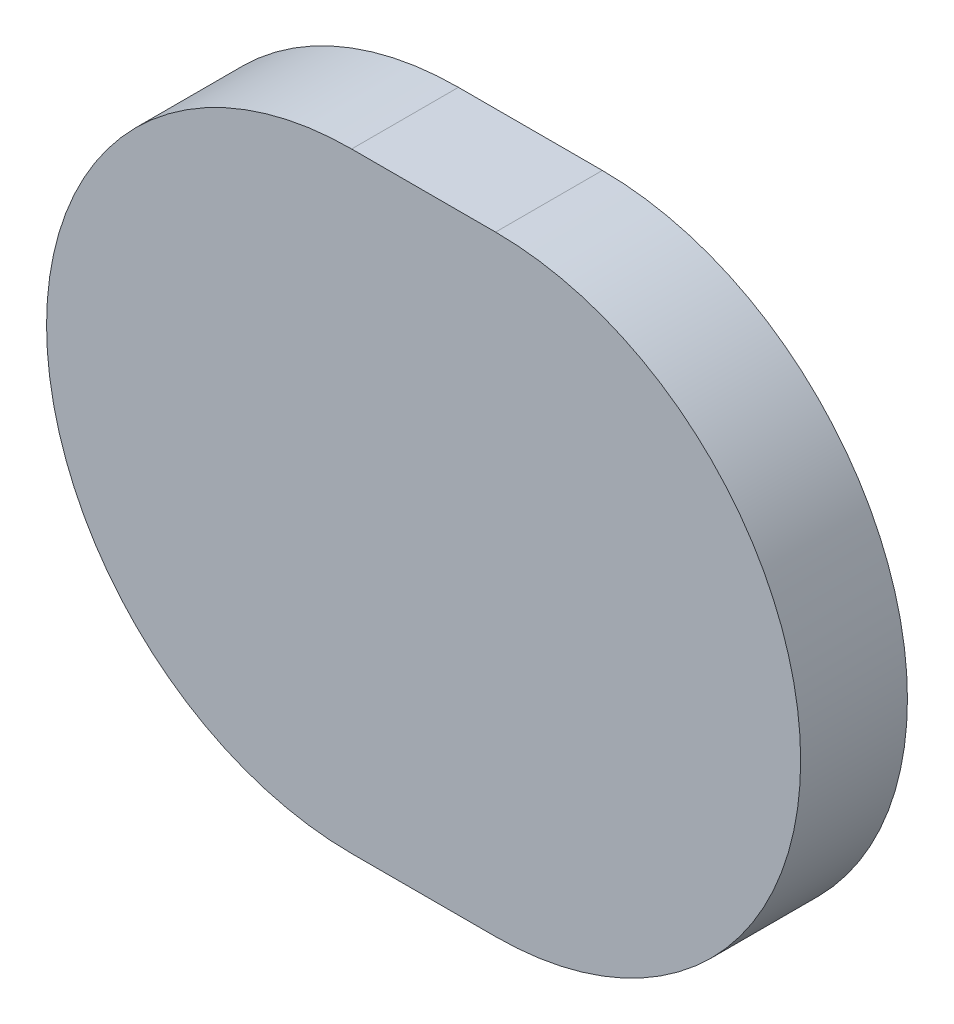
ISO-10303-21;
HEADER;
FILE_DESCRIPTION(('STEP AP214'),'2;1');
FILE_NAME('part.step','',(''),(''),'','','');
FILE_SCHEMA(('AUTOMOTIVE_DESIGN { 1 0 10303 214 1 1 1 1 }'));
ENDSEC;
DATA;
#1=APPLICATION_CONTEXT('core data for automotive mechanical design processes');
#2=APPLICATION_PROTOCOL_DEFINITION('international standard','automotive_design',2000,#1);
#3=PRODUCT_CONTEXT('',#1,'mechanical');
#4=PRODUCT('Part','Part','',(#3));
#5=PRODUCT_RELATED_PRODUCT_CATEGORY('part','',(#4));
#6=PRODUCT_DEFINITION_FORMATION('','',#4);
#7=PRODUCT_DEFINITION_CONTEXT('part definition',#1,'design');
#8=PRODUCT_DEFINITION('design','',#6,#7);
#9=PRODUCT_DEFINITION_SHAPE('','',#8);
#10=(LENGTH_UNIT() NAMED_UNIT(*) SI_UNIT(.MILLI.,.METRE.));
#11=(NAMED_UNIT(*) PLANE_ANGLE_UNIT() SI_UNIT($,.RADIAN.));
#12=(NAMED_UNIT(*) SI_UNIT($,.STERADIAN.) SOLID_ANGLE_UNIT());
#13=UNCERTAINTY_MEASURE_WITH_UNIT(LENGTH_MEASURE(1.E-05),#10,'distance_accuracy_value','');
#14=(GEOMETRIC_REPRESENTATION_CONTEXT(3) GLOBAL_UNCERTAINTY_ASSIGNED_CONTEXT((#13)) GLOBAL_UNIT_ASSIGNED_CONTEXT((#10,
#11,#12)) REPRESENTATION_CONTEXT('',''));
#15=CARTESIAN_POINT('',(0.,0.,0.));
#16=DIRECTION('',(0.,0.,1.));
#17=DIRECTION('',(1.,0.,0.));
#18=AXIS2_PLACEMENT_3D('',#15,#16,#17);
#19=CARTESIAN_POINT('',(90.397184,-124.990812,1.635));
#20=DIRECTION('',(0.,0.,1.));
#21=DIRECTION('',(1.,0.,0.));
#22=AXIS2_PLACEMENT_3D('',#19,#20,#21);
#23=PLANE('',#22);
#24=DIRECTION('',(1.,0.,0.));
#25=VECTOR('',#24,1.);
#26=CARTESIAN_POINT('',(90.397184,-124.990812,1.635));
#27=LINE('',#26,#25);
#28=CARTESIAN_POINT('',(90.397184,-124.990812,1.635));
#29=VERTEX_POINT('',#28);
#30=CARTESIAN_POINT('',(90.444365,-124.990812,1.635));
#31=VERTEX_POINT('',#30);
#32=EDGE_CURVE('E83',#29,#31,#27,.T.);
#33=ORIENTED_EDGE('',*,*,#32,.T.);
#34=CARTESIAN_POINT('',(90.444365,-124.890812,1.635));
#35=DIRECTION('',(0.,0.,1.));
#36=DIRECTION('',(0.,-1.,0.));
#37=AXIS2_PLACEMENT_3D('',#34,#35,#36);
#38=CIRCLE('',#37,0.1);
#39=CARTESIAN_POINT('',(90.444365,-124.790812,1.635));
#40=VERTEX_POINT('',#39);
#41=EDGE_CURVE('E105',#31,#40,#38,.T.);
#42=ORIENTED_EDGE('',*,*,#41,.T.);
#43=DIRECTION('',(-1.,0.,0.));
#44=VECTOR('',#43,1.);
#45=CARTESIAN_POINT('',(90.444365,-124.790812,1.635));
#46=LINE('',#45,#44);
#47=CARTESIAN_POINT('',(90.397184,-124.790812,1.635));
#48=VERTEX_POINT('',#47);
#49=EDGE_CURVE('E76',#40,#48,#46,.T.);
#50=ORIENTED_EDGE('',*,*,#49,.T.);
#51=CARTESIAN_POINT('',(90.397184,-124.890812,1.635));
#52=DIRECTION('',(0.,0.,1.));
#53=DIRECTION('',(0.,1.,0.));
#54=AXIS2_PLACEMENT_3D('',#51,#52,#53);
#55=CIRCLE('',#54,0.1);
#56=EDGE_CURVE('E11',#48,#29,#55,.T.);
#57=ORIENTED_EDGE('',*,*,#56,.T.);
#58=EDGE_LOOP('',(#33,#42,#50,#57));
#59=FACE_BOUND('',#58,.T.);
#60=ADVANCED_FACE('F17',(#59),#23,.T.);
#61=CARTESIAN_POINT('',(90.397184,-124.990812,1.6));
#62=DIRECTION('',(0.,0.,1.));
#63=DIRECTION('',(1.,0.,0.));
#64=AXIS2_PLACEMENT_3D('',#61,#62,#63);
#65=PLANE('',#64);
#66=CARTESIAN_POINT('',(90.397184,-124.890812,1.6));
#67=DIRECTION('',(0.,0.,1.));
#68=DIRECTION('',(0.,1.,0.));
#69=AXIS2_PLACEMENT_3D('',#66,#67,#68);
#70=CIRCLE('',#69,0.1);
#71=CARTESIAN_POINT('',(90.397184,-124.790812,1.6));
#72=VERTEX_POINT('',#71);
#73=CARTESIAN_POINT('',(90.397184,-124.990812,1.6));
#74=VERTEX_POINT('',#73);
#75=EDGE_CURVE('E21',#72,#74,#70,.T.);
#76=ORIENTED_EDGE('',*,*,#75,.F.);
#77=DIRECTION('',(-1.,0.,0.));
#78=VECTOR('',#77,1.);
#79=CARTESIAN_POINT('',(90.444365,-124.790812,1.6));
#80=LINE('',#79,#78);
#81=CARTESIAN_POINT('',(90.444365,-124.790812,1.6));
#82=VERTEX_POINT('',#81);
#83=EDGE_CURVE('E109',#82,#72,#80,.T.);
#84=ORIENTED_EDGE('',*,*,#83,.F.);
#85=CARTESIAN_POINT('',(90.444365,-124.890812,1.6));
#86=DIRECTION('',(0.,0.,1.));
#87=DIRECTION('',(0.,-1.,0.));
#88=AXIS2_PLACEMENT_3D('',#85,#86,#87);
#89=CIRCLE('',#88,0.1);
#90=CARTESIAN_POINT('',(90.444365,-124.990812,1.6));
#91=VERTEX_POINT('',#90);
#92=EDGE_CURVE('E85',#91,#82,#89,.T.);
#93=ORIENTED_EDGE('',*,*,#92,.F.);
#94=DIRECTION('',(1.,0.,0.));
#95=VECTOR('',#94,1.);
#96=CARTESIAN_POINT('',(90.397184,-124.990812,1.6));
#97=LINE('',#96,#95);
#98=EDGE_CURVE('E81',#74,#91,#97,.T.);
#99=ORIENTED_EDGE('',*,*,#98,.F.);
#100=EDGE_LOOP('',(#76,#84,#93,#99));
#101=FACE_BOUND('',#100,.T.);
#102=ADVANCED_FACE('F19',(#101),#65,.F.);
#103=CARTESIAN_POINT('',(90.397184,-124.890812,1.6));
#104=DIRECTION('',(0.,0.,-1.));
#105=DIRECTION('',(0.,1.,0.));
#106=AXIS2_PLACEMENT_3D('',#103,#104,#105);
#107=CYLINDRICAL_SURFACE('',#106,0.1);
#108=ORIENTED_EDGE('',*,*,#75,.T.);
#109=DIRECTION('',(0.,0.,1.));
#110=VECTOR('',#109,1.);
#111=CARTESIAN_POINT('',(90.397184,-124.990812,1.6));
#112=LINE('',#111,#110);
#113=EDGE_CURVE('E70',#74,#29,#112,.T.);
#114=ORIENTED_EDGE('',*,*,#113,.T.);
#115=ORIENTED_EDGE('',*,*,#56,.F.);
#116=DIRECTION('',(0.,0.,1.));
#117=VECTOR('',#116,1.);
#118=CARTESIAN_POINT('',(90.397184,-124.790812,1.6));
#119=LINE('',#118,#117);
#120=EDGE_CURVE('E73',#72,#48,#119,.T.);
#121=ORIENTED_EDGE('',*,*,#120,.F.);
#122=EDGE_LOOP('',(#108,#114,#115,#121));
#123=FACE_BOUND('',#122,.T.);
#124=ADVANCED_FACE('F69',(#123),#107,.T.);
#125=CARTESIAN_POINT('',(90.444365,-124.790812,1.6));
#126=DIRECTION('',(0.,-1.,0.));
#127=DIRECTION('',(0.,0.,-1.));
#128=AXIS2_PLACEMENT_3D('',#125,#126,#127);
#129=PLANE('',#128);
#130=ORIENTED_EDGE('',*,*,#83,.T.);
#131=ORIENTED_EDGE('',*,*,#120,.T.);
#132=ORIENTED_EDGE('',*,*,#49,.F.);
#133=DIRECTION('',(0.,0.,1.));
#134=VECTOR('',#133,1.);
#135=CARTESIAN_POINT('',(90.444365,-124.790812,1.6));
#136=LINE('',#135,#134);
#137=EDGE_CURVE('E102',#82,#40,#136,.T.);
#138=ORIENTED_EDGE('',*,*,#137,.F.);
#139=EDGE_LOOP('',(#130,#131,#132,#138));
#140=FACE_BOUND('',#139,.T.);
#141=ADVANCED_FACE('F120',(#140),#129,.F.);
#142=CARTESIAN_POINT('',(90.444365,-124.890812,1.6));
#143=DIRECTION('',(0.,0.,-1.));
#144=DIRECTION('',(0.,-1.,0.));
#145=AXIS2_PLACEMENT_3D('',#142,#143,#144);
#146=CYLINDRICAL_SURFACE('',#145,0.1);
#147=ORIENTED_EDGE('',*,*,#92,.T.);
#148=ORIENTED_EDGE('',*,*,#137,.T.);
#149=ORIENTED_EDGE('',*,*,#41,.F.);
#150=DIRECTION('',(0.,0.,1.));
#151=VECTOR('',#150,1.);
#152=CARTESIAN_POINT('',(90.444365,-124.990812,1.6));
#153=LINE('',#152,#151);
#154=EDGE_CURVE('E90',#91,#31,#153,.T.);
#155=ORIENTED_EDGE('',*,*,#154,.F.);
#156=EDGE_LOOP('',(#147,#148,#149,#155));
#157=FACE_BOUND('',#156,.T.);
#158=ADVANCED_FACE('F122',(#157),#146,.T.);
#159=CARTESIAN_POINT('',(90.397184,-124.990812,1.6));
#160=DIRECTION('',(0.,1.,0.));
#161=DIRECTION('',(1.,0.,0.));
#162=AXIS2_PLACEMENT_3D('',#159,#160,#161);
#163=PLANE('',#162);
#164=ORIENTED_EDGE('',*,*,#98,.T.);
#165=ORIENTED_EDGE('',*,*,#154,.T.);
#166=ORIENTED_EDGE('',*,*,#32,.F.);
#167=ORIENTED_EDGE('',*,*,#113,.F.);
#168=EDGE_LOOP('',(#164,#165,#166,#167));
#169=FACE_BOUND('',#168,.T.);
#170=ADVANCED_FACE('F79',(#169),#163,.F.);
#171=CLOSED_SHELL('',(#60,#102,#124,#141,#158,#170));
#172=MANIFOLD_SOLID_BREP('B1',#171);
#173=ADVANCED_BREP_SHAPE_REPRESENTATION('',(#18,#172),#14);
#174=SHAPE_DEFINITION_REPRESENTATION(#9,#173);
ENDSEC;
END-ISO-10303-21;
